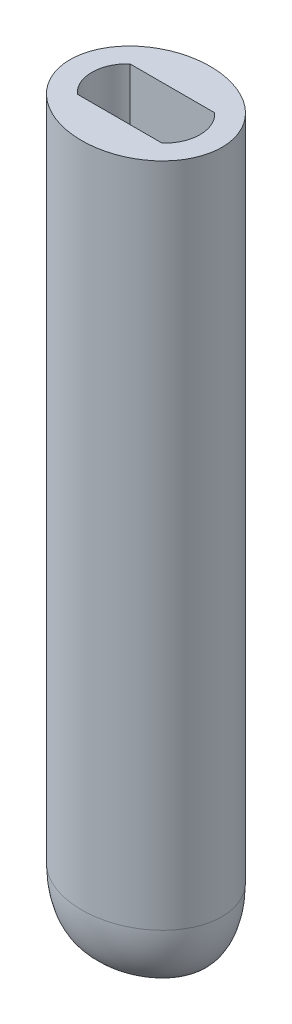
ISO-10303-21;
HEADER;
FILE_DESCRIPTION(('STEP AP214'),'2;1');
FILE_NAME('part.step','',(''),(''),'','','');
FILE_SCHEMA(('AUTOMOTIVE_DESIGN { 1 0 10303 214 1 1 1 1 }'));
ENDSEC;
DATA;
#1=APPLICATION_CONTEXT('core data for automotive mechanical design processes');
#2=APPLICATION_PROTOCOL_DEFINITION('international standard','automotive_design',2000,#1);
#3=PRODUCT_CONTEXT('',#1,'mechanical');
#4=PRODUCT('Part','Part','',(#3));
#5=PRODUCT_RELATED_PRODUCT_CATEGORY('part','',(#4));
#6=PRODUCT_DEFINITION_FORMATION('','',#4);
#7=PRODUCT_DEFINITION_CONTEXT('part definition',#1,'design');
#8=PRODUCT_DEFINITION('design','',#6,#7);
#9=PRODUCT_DEFINITION_SHAPE('','',#8);
#10=(LENGTH_UNIT() NAMED_UNIT(*) SI_UNIT(.MILLI.,.METRE.));
#11=(NAMED_UNIT(*) PLANE_ANGLE_UNIT() SI_UNIT($,.RADIAN.));
#12=(NAMED_UNIT(*) SI_UNIT($,.STERADIAN.) SOLID_ANGLE_UNIT());
#13=UNCERTAINTY_MEASURE_WITH_UNIT(LENGTH_MEASURE(1.E-05),#10,'distance_accuracy_value','');
#14=(GEOMETRIC_REPRESENTATION_CONTEXT(3) GLOBAL_UNCERTAINTY_ASSIGNED_CONTEXT((#13)) GLOBAL_UNIT_ASSIGNED_CONTEXT((#10,
#11,#12)) REPRESENTATION_CONTEXT('',''));
#15=CARTESIAN_POINT('',(0.,0.,0.));
#16=DIRECTION('',(0.,0.,1.));
#17=DIRECTION('',(1.,0.,0.));
#18=AXIS2_PLACEMENT_3D('',#15,#16,#17);
#19=CARTESIAN_POINT('',(0.,124.,0.));
#20=DIRECTION('',(0.,1.,0.));
#21=DIRECTION('',(1.,0.,0.));
#22=AXIS2_PLACEMENT_3D('',#19,#20,#21);
#23=ELLIPSE('',#22,13.,11.);
#24=DIRECTION('',(0.,-1.,0.));
#25=VECTOR('',#24,1.);
#26=SURFACE_OF_LINEAR_EXTRUSION('',#23,#25);
#27=CARTESIAN_POINT('',(0.,9.99999999999999,0.));
#28=DIRECTION('',(0.,1.,0.));
#29=DIRECTION('',(1.,0.,0.));
#30=AXIS2_PLACEMENT_3D('',#27,#28,#29);
#31=ELLIPSE('',#30,13.,11.);
#32=CARTESIAN_POINT('',(13.,9.99999999999999,0.));
#33=VERTEX_POINT('',#32);
#34=EDGE_CURVE('E63',#33,#33,#31,.T.);
#35=ORIENTED_EDGE('',*,*,#34,.T.);
#36=EDGE_LOOP('',(#35));
#37=FACE_BOUND('',#36,.T.);
#38=CARTESIAN_POINT('',(13.,124.,0.));
#39=VERTEX_POINT('',#38);
#40=EDGE_CURVE('E170',#39,#39,#23,.T.);
#41=ORIENTED_EDGE('',*,*,#40,.F.);
#42=EDGE_LOOP('',(#41));
#43=FACE_BOUND('',#42,.T.);
#44=ADVANCED_FACE('F48',(#37,#43),#26,.F.);
#45=CARTESIAN_POINT('',(0.,124.,0.));
#46=DIRECTION('',(0.,1.,0.));
#47=DIRECTION('',(0.,0.,1.));
#48=AXIS2_PLACEMENT_3D('',#45,#46,#47);
#49=PLANE('',#48);
#50=DIRECTION('',(-1.,0.,0.));
#51=VECTOR('',#50,1.);
#52=CARTESIAN_POINT('',(0.,124.,-4.5));
#53=LINE('',#52,#51);
#54=CARTESIAN_POINT('',(7.25,124.,-4.5));
#55=VERTEX_POINT('',#54);
#56=CARTESIAN_POINT('',(-7.25,124.,-4.5));
#57=VERTEX_POINT('',#56);
#58=EDGE_CURVE('E141',#55,#57,#53,.T.);
#59=ORIENTED_EDGE('',*,*,#58,.F.);
#60=CARTESIAN_POINT('',(3.18750000000001,124.,0.));
#61=DIRECTION('',(0.,1.,0.));
#62=DIRECTION('',(0.,0.,1.));
#63=AXIS2_PLACEMENT_3D('',#60,#61,#62);
#64=CIRCLE('',#63,6.06249999999999);
#65=CARTESIAN_POINT('',(7.25,124.,4.5));
#66=VERTEX_POINT('',#65);
#67=EDGE_CURVE('E127',#66,#55,#64,.T.);
#68=ORIENTED_EDGE('',*,*,#67,.F.);
#69=DIRECTION('',(-1.,0.,0.));
#70=VECTOR('',#69,1.);
#71=CARTESIAN_POINT('',(0.,124.,4.5));
#72=LINE('',#71,#70);
#73=CARTESIAN_POINT('',(-7.25,124.,4.5));
#74=VERTEX_POINT('',#73);
#75=EDGE_CURVE('E117',#66,#74,#72,.T.);
#76=ORIENTED_EDGE('',*,*,#75,.T.);
#77=CARTESIAN_POINT('',(-3.18750000000001,124.,0.));
#78=DIRECTION('',(0.,1.,0.));
#79=DIRECTION('',(0.,0.,1.));
#80=AXIS2_PLACEMENT_3D('',#77,#78,#79);
#81=CIRCLE('',#80,6.0625);
#82=EDGE_CURVE('E159',#57,#74,#81,.T.);
#83=ORIENTED_EDGE('',*,*,#82,.F.);
#84=EDGE_LOOP('',(#59,#68,#76,#83));
#85=FACE_BOUND('',#84,.T.);
#86=ORIENTED_EDGE('',*,*,#40,.T.);
#87=EDGE_LOOP('',(#86));
#88=FACE_BOUND('',#87,.T.);
#89=ADVANCED_FACE('F197',(#85,#88),#49,.T.);
#90=CARTESIAN_POINT('',(0.,0.,0.));
#91=DIRECTION('',(0.,1.,0.));
#92=DIRECTION('',(0.,0.,1.));
#93=AXIS2_PLACEMENT_3D('',#90,#91,#92);
#94=PLANE('',#93);
#95=CARTESIAN_POINT('',(8.,0.,0.));
#96=CARTESIAN_POINT('',(7.99999999972763,0.,-0.228877442948684));
#97=CARTESIAN_POINT('',(7.98164236606913,0.,-0.459540016333988));
#98=CARTESIAN_POINT('',(7.90790402202729,0.,-0.9183049047839));
#99=CARTESIAN_POINT('',(7.85340341439475,0.,-1.14212034129708));
#100=CARTESIAN_POINT('',(7.64180863958996,0.,-1.79838162336414));
#101=CARTESIAN_POINT('',(7.43333908743893,0.,-2.21959352487654));
#102=CARTESIAN_POINT('',(6.92903329010157,0.,-2.98595239298466));
#103=CARTESIAN_POINT('',(6.63069425532383,0.,-3.33824763709381));
#104=CARTESIAN_POINT('',(5.96426530908331,0.,-3.98002289664604));
#105=CARTESIAN_POINT('',(5.60409911853582,0.,-4.26253454395652));
#106=CARTESIAN_POINT('',(4.83922363735247,0.,-4.76413385704761));
#107=CARTESIAN_POINT('',(4.43096100447353,0.,-4.98442598860135));
#108=CARTESIAN_POINT('',(3.58985783020149,0.,-5.35775624144088));
#109=CARTESIAN_POINT('',(3.15937499623236,0.,-5.51047539568657));
#110=CARTESIAN_POINT('',(1.84116575911605,0.,-5.87716205036435));
#111=CARTESIAN_POINT('',(0.915424036952234,0.,-5.99982690128381));
#112=CARTESIAN_POINT('',(-0.454769357822972,0.,-6.00008627084414));
#113=CARTESIAN_POINT('',(-0.910480837044084,0.,-5.97019375078479));
#114=CARTESIAN_POINT('',(-1.819805851432,0.,-5.84872669287733));
#115=CARTESIAN_POINT('',(-2.27517016456728,0.,-5.7562028964282));
#116=CARTESIAN_POINT('',(-3.59588571633571,0.,-5.38951152925792));
#117=CARTESIAN_POINT('',(-4.43236282833363,0.,-5.02864672327698));
#118=CARTESIAN_POINT('',(-5.59566302731619,0.,-4.26918806976489));
#119=CARTESIAN_POINT('',(-5.95679519244455,0.,-3.98593431323932));
#120=CARTESIAN_POINT('',(-6.61861938618145,0.,-3.35112079939542));
#121=CARTESIAN_POINT('',(-6.92232818280514,0.,-2.99464865820981));
#122=CARTESIAN_POINT('',(-7.30237128962722,0.,-2.41933873385911));
#123=CARTESIAN_POINT('',(-7.41696257263887,0.,-2.22057571547325));
#124=CARTESIAN_POINT('',(-7.61944686589255,0.,-1.80760666743317));
#125=CARTESIAN_POINT('',(-7.70789802865545,0.,-1.5915571215976));
#126=CARTESIAN_POINT('',(-7.9224305128259,0.,-0.931597655198713));
#127=CARTESIAN_POINT('',(-7.99851139857637,0.,-0.479397298639151));
#128=CARTESIAN_POINT('',(-8.0014458658257,0.,0.452261224488354));
#129=CARTESIAN_POINT('',(-7.92804620718767,0.,0.905714056413743));
#130=CARTESIAN_POINT('',(-7.71715573948729,0.,1.56702613222351));
#131=CARTESIAN_POINT('',(-7.62986658955126,0.,1.7835818314944));
#132=CARTESIAN_POINT('',(-7.42907233675657,0.,2.19835832257909));
#133=CARTESIAN_POINT('',(-7.31505449422945,0.,2.39830644193684));
#134=CARTESIAN_POINT('',(-7.06216100495188,0.,2.78462445184592));
#135=CARTESIAN_POINT('',(-6.92249968933252,0.,2.97173328183747));
#136=CARTESIAN_POINT('',(-6.62653568459602,0.,3.32531076864082));
#137=CARTESIAN_POINT('',(-6.46971741730565,0.,3.49277132963876));
#138=CARTESIAN_POINT('',(-5.97554905754585,0.,3.97011931396288));
#139=CARTESIAN_POINT('',(-5.61250945538473,0.,4.25663662708803));
#140=CARTESIAN_POINT('',(-4.83998445239494,0.,4.7640128923043));
#141=CARTESIAN_POINT('',(-4.43694874158167,0.,4.98120763977985));
#142=CARTESIAN_POINT('',(-3.60205593094995,0.,5.35289058711788));
#143=CARTESIAN_POINT('',(-3.17014136860081,0.,5.50725376604027));
#144=CARTESIAN_POINT('',(-1.83284069570989,0.,5.87992798274595));
#145=CARTESIAN_POINT('',(-0.925176610477265,0.,5.99976799148196));
#146=CARTESIAN_POINT('',(0.458684438653842,0.,6.00011551407796));
#147=CARTESIAN_POINT('',(0.919318873192822,0.,5.96932013924091));
#148=CARTESIAN_POINT('',(1.82454636805553,0.,5.84778185094474));
#149=CARTESIAN_POINT('',(2.27143787700007,0.,5.75708114280177));
#150=CARTESIAN_POINT('',(3.1531594860563,0.,5.51258958596749));
#151=CARTESIAN_POINT('',(3.59154999683439,0.,5.35709167160275));
#152=CARTESIAN_POINT('',(4.43209390908302,0.,4.98383633713673));
#153=CARTESIAN_POINT('',(4.83489158182094,0.,4.76669223705946));
#154=CARTESIAN_POINT('',(5.6015833961141,0.,4.26446436976961));
#155=CARTESIAN_POINT('',(5.96888381584621,0.,3.97590262652142));
#156=CARTESIAN_POINT('',(6.63113170719435,0.,3.33749647917524));
#157=CARTESIAN_POINT('',(6.92809814457379,0.,2.9878034555853));
#158=CARTESIAN_POINT('',(7.43744824333454,0.,2.21291645027878));
#159=CARTESIAN_POINT('',(7.64216682969166,0.,1.79792700009657));
#160=CARTESIAN_POINT('',(7.85416919760889,0.,1.13941491551006));
#161=CARTESIAN_POINT('',(7.90924609344523,0.,0.91150345538579));
#162=CARTESIAN_POINT('',(7.98180434825774,0.,0.456951641803168));
#163=CARTESIAN_POINT('',(8.00000000027237,0.,0.228877442948682));
#164=CARTESIAN_POINT('',(8.,0.,0.));
#165=(BOUNDED_CURVE() B_SPLINE_CURVE(3,(#95,#96,#97,#98,#99,#100,#101,#102,#103,#104,#105,#106,
#107,#108,#109,#110,#111,#112,#113,#114,#115,#116,#117,#118,#119,#120,#121,#122,#123,#124,#125,
#126,#127,#128,#129,#130,#131,#132,#133,#134,#135,#136,#137,#138,#139,#140,#141,#142,#143,#144,
#145,#146,#147,#148,#149,#150,#151,#152,#153,#154,#155,#156,#157,#158,#159,#160,#161,#162,#163,
#164),.UNSPECIFIED.,.T.,.F.) B_SPLINE_CURVE_WITH_KNOTS((4,2,2,2,2,2,2,2,2,2,2,2,2,2,2,2,2,2,2,2,
2,2,2,2,2,2,2,2,2,2,2,2,2,2,4),(0.0010101898899887,0.00169615415200086,0.00238211841401302,
0.00375404693803733,0.00512597546206164,0.00649790398608596,0.00786983251011027,
0.00924176103413459,0.0119856180821832,0.0133575466062075,0.0147294751302318,0.0174733321782805,
0.0188452607023048,0.0202171892263291,0.0209031534883413,0.0215891177503534,0.0229610462743777,
0.024332974798402,0.0250189390604142,0.0257049033224264,0.0263908675844385,0.0270768318464507,
0.028448760370475,0.0298206888944993,0.0311926174185236,0.0339364744665722,0.0353084029905966,
0.0366803315146209,0.0380522600386452,0.0394241885626695,0.0407961170866938,0.0421680456107181,
0.0435399741347424,0.0442259383967546,0.0449119026587667),
.UNSPECIFIED.) CURVE() GEOMETRIC_REPRESENTATION_ITEM() RATIONAL_B_SPLINE_CURVE((1.,1.,1.,1.,1.,
1.,1.,1.,1.,1.,1.,1.,1.,1.,1.,1.,1.,1.,1.,1.,1.,1.,1.,1.,1.,1.,1.,1.,1.,1.,1.,1.,1.,1.,1.,1.,1.,
1.,1.,1.,1.,1.,1.,1.,1.,1.,1.,1.,1.,1.,1.,1.,1.,1.,1.,1.,1.,1.,1.,1.,1.,1.,1.,1.,1.,1.,1.,1.,1.,1.)) REPRESENTATION_ITEM(''));
#166=CARTESIAN_POINT('',(8.,0.,0.));
#167=VERTEX_POINT('',#166);
#168=EDGE_CURVE('E12',#167,#167,#165,.F.);
#169=ORIENTED_EDGE('',*,*,#168,.T.);
#170=EDGE_LOOP('',(#169));
#171=FACE_BOUND('',#170,.T.);
#172=ADVANCED_FACE('F199',(#171),#94,.F.);
#173=CARTESIAN_POINT('',(3.18750000000001,94.,0.));
#174=DIRECTION('',(0.,1.,0.));
#175=DIRECTION('',(0.,0.,1.));
#176=AXIS2_PLACEMENT_3D('',#173,#174,#175);
#177=CYLINDRICAL_SURFACE('',#176,6.06249999999999);
#178=ORIENTED_EDGE('',*,*,#67,.T.);
#179=DIRECTION('',(0.,1.,0.));
#180=VECTOR('',#179,1.);
#181=CARTESIAN_POINT('',(7.25,94.,-4.5));
#182=LINE('',#181,#180);
#183=CARTESIAN_POINT('',(7.25,94.,-4.5));
#184=VERTEX_POINT('',#183);
#185=EDGE_CURVE('E179',#184,#55,#182,.T.);
#186=ORIENTED_EDGE('',*,*,#185,.F.);
#187=CARTESIAN_POINT('',(3.18750000000001,94.,0.));
#188=DIRECTION('',(0.,1.,0.));
#189=DIRECTION('',(0.,0.,1.));
#190=AXIS2_PLACEMENT_3D('',#187,#188,#189);
#191=CIRCLE('',#190,6.06249999999999);
#192=CARTESIAN_POINT('',(7.25,94.,4.5));
#193=VERTEX_POINT('',#192);
#194=EDGE_CURVE('E173',#193,#184,#191,.T.);
#195=ORIENTED_EDGE('',*,*,#194,.F.);
#196=DIRECTION('',(0.,1.,0.));
#197=VECTOR('',#196,1.);
#198=CARTESIAN_POINT('',(7.25,94.,4.5));
#199=LINE('',#198,#197);
#200=EDGE_CURVE('E167',#193,#66,#199,.T.);
#201=ORIENTED_EDGE('',*,*,#200,.T.);
#202=EDGE_LOOP('',(#178,#186,#195,#201));
#203=FACE_BOUND('',#202,.T.);
#204=ADVANCED_FACE('F262',(#203),#177,.F.);
#205=CARTESIAN_POINT('',(3.18750000000001,94.,0.));
#206=DIRECTION('',(0.,1.,0.));
#207=DIRECTION('',(0.,0.,1.));
#208=AXIS2_PLACEMENT_3D('',#205,#206,#207);
#209=PLANE('',#208);
#210=ORIENTED_EDGE('',*,*,#194,.T.);
#211=DIRECTION('',(0.,0.,-1.));
#212=VECTOR('',#211,1.);
#213=CARTESIAN_POINT('',(7.25,94.,0.));
#214=LINE('',#213,#212);
#215=EDGE_CURVE('E78',#193,#184,#214,.T.);
#216=ORIENTED_EDGE('',*,*,#215,.F.);
#217=EDGE_LOOP('',(#210,#216));
#218=FACE_BOUND('',#217,.T.);
#219=ADVANCED_FACE('F258',(#218),#209,.T.);
#220=CARTESIAN_POINT('',(-3.18750000000001,94.,0.));
#221=DIRECTION('',(0.,1.,0.));
#222=DIRECTION('',(0.,0.,1.));
#223=AXIS2_PLACEMENT_3D('',#220,#221,#222);
#224=CYLINDRICAL_SURFACE('',#223,6.0625);
#225=ORIENTED_EDGE('',*,*,#82,.T.);
#226=DIRECTION('',(0.,1.,0.));
#227=VECTOR('',#226,1.);
#228=CARTESIAN_POINT('',(-7.25,94.,4.5));
#229=LINE('',#228,#227);
#230=CARTESIAN_POINT('',(-7.25,94.,4.5));
#231=VERTEX_POINT('',#230);
#232=EDGE_CURVE('E163',#231,#74,#229,.T.);
#233=ORIENTED_EDGE('',*,*,#232,.F.);
#234=CARTESIAN_POINT('',(-3.18750000000001,94.,0.));
#235=DIRECTION('',(0.,1.,0.));
#236=DIRECTION('',(0.,0.,1.));
#237=AXIS2_PLACEMENT_3D('',#234,#235,#236);
#238=CIRCLE('',#237,6.0625);
#239=CARTESIAN_POINT('',(-7.25,94.,-4.5));
#240=VERTEX_POINT('',#239);
#241=EDGE_CURVE('E154',#240,#231,#238,.T.);
#242=ORIENTED_EDGE('',*,*,#241,.F.);
#243=DIRECTION('',(0.,1.,0.));
#244=VECTOR('',#243,1.);
#245=CARTESIAN_POINT('',(-7.25,94.,-4.5));
#246=LINE('',#245,#244);
#247=EDGE_CURVE('E124',#240,#57,#246,.T.);
#248=ORIENTED_EDGE('',*,*,#247,.T.);
#249=EDGE_LOOP('',(#225,#233,#242,#248));
#250=FACE_BOUND('',#249,.T.);
#251=ADVANCED_FACE('F254',(#250),#224,.F.);
#252=CARTESIAN_POINT('',(-3.18750000000001,94.,0.));
#253=DIRECTION('',(0.,1.,0.));
#254=DIRECTION('',(0.,0.,1.));
#255=AXIS2_PLACEMENT_3D('',#252,#253,#254);
#256=PLANE('',#255);
#257=ORIENTED_EDGE('',*,*,#241,.T.);
#258=DIRECTION('',(0.,0.,-1.));
#259=VECTOR('',#258,1.);
#260=CARTESIAN_POINT('',(-7.25,94.,0.));
#261=LINE('',#260,#259);
#262=EDGE_CURVE('E158',#231,#240,#261,.T.);
#263=ORIENTED_EDGE('',*,*,#262,.T.);
#264=EDGE_LOOP('',(#257,#263));
#265=FACE_BOUND('',#264,.T.);
#266=ADVANCED_FACE('F251',(#265),#256,.T.);
#267=CARTESIAN_POINT('',(-7.25,24.,0.));
#268=DIRECTION('',(1.,0.,0.));
#269=DIRECTION('',(0.,0.,-1.));
#270=AXIS2_PLACEMENT_3D('',#267,#268,#269);
#271=PLANE('',#270);
#272=DIRECTION('',(0.,1.,0.));
#273=VECTOR('',#272,1.);
#274=CARTESIAN_POINT('',(-7.25,24.,4.5));
#275=LINE('',#274,#273);
#276=CARTESIAN_POINT('',(-7.25,24.,4.5));
#277=VERTEX_POINT('',#276);
#278=EDGE_CURVE('E111',#277,#231,#275,.T.);
#279=ORIENTED_EDGE('',*,*,#278,.F.);
#280=DIRECTION('',(0.,0.,-1.));
#281=VECTOR('',#280,1.);
#282=CARTESIAN_POINT('',(-7.25,24.,0.));
#283=LINE('',#282,#281);
#284=CARTESIAN_POINT('',(-7.25,24.,-4.5));
#285=VERTEX_POINT('',#284);
#286=EDGE_CURVE('E108',#277,#285,#283,.T.);
#287=ORIENTED_EDGE('',*,*,#286,.T.);
#288=DIRECTION('',(0.,1.,0.));
#289=VECTOR('',#288,1.);
#290=CARTESIAN_POINT('',(-7.25,24.,-4.5));
#291=LINE('',#290,#289);
#292=EDGE_CURVE('E70',#285,#240,#291,.T.);
#293=ORIENTED_EDGE('',*,*,#292,.T.);
#294=ORIENTED_EDGE('',*,*,#262,.F.);
#295=EDGE_LOOP('',(#279,#287,#293,#294));
#296=FACE_BOUND('',#295,.T.);
#297=ADVANCED_FACE('F109',(#296),#271,.T.);
#298=CARTESIAN_POINT('',(0.,24.,-4.5));
#299=DIRECTION('',(0.,0.,-1.));
#300=DIRECTION('',(-1.,0.,0.));
#301=AXIS2_PLACEMENT_3D('',#298,#299,#300);
#302=PLANE('',#301);
#303=ORIENTED_EDGE('',*,*,#58,.T.);
#304=ORIENTED_EDGE('',*,*,#247,.F.);
#305=ORIENTED_EDGE('',*,*,#292,.F.);
#306=DIRECTION('',(-1.,0.,0.));
#307=VECTOR('',#306,1.);
#308=CARTESIAN_POINT('',(0.,24.,-4.5));
#309=LINE('',#308,#307);
#310=CARTESIAN_POINT('',(7.25,24.,-4.5));
#311=VERTEX_POINT('',#310);
#312=EDGE_CURVE('E116',#311,#285,#309,.T.);
#313=ORIENTED_EDGE('',*,*,#312,.F.);
#314=DIRECTION('',(0.,1.,0.));
#315=VECTOR('',#314,1.);
#316=CARTESIAN_POINT('',(7.25,24.,-4.5));
#317=LINE('',#316,#315);
#318=EDGE_CURVE('E128',#311,#184,#317,.T.);
#319=ORIENTED_EDGE('',*,*,#318,.T.);
#320=ORIENTED_EDGE('',*,*,#185,.T.);
#321=EDGE_LOOP('',(#303,#304,#305,#313,#319,#320));
#322=FACE_BOUND('',#321,.T.);
#323=ADVANCED_FACE('F121',(#322),#302,.F.);
#324=CARTESIAN_POINT('',(7.25,24.,0.));
#325=DIRECTION('',(1.,0.,0.));
#326=DIRECTION('',(0.,0.,-1.));
#327=AXIS2_PLACEMENT_3D('',#324,#325,#326);
#328=PLANE('',#327);
#329=ORIENTED_EDGE('',*,*,#215,.T.);
#330=ORIENTED_EDGE('',*,*,#318,.F.);
#331=DIRECTION('',(0.,0.,-1.));
#332=VECTOR('',#331,1.);
#333=CARTESIAN_POINT('',(7.25,24.,0.));
#334=LINE('',#333,#332);
#335=CARTESIAN_POINT('',(7.25,24.,4.5));
#336=VERTEX_POINT('',#335);
#337=EDGE_CURVE('E132',#336,#311,#334,.T.);
#338=ORIENTED_EDGE('',*,*,#337,.F.);
#339=DIRECTION('',(0.,1.,0.));
#340=VECTOR('',#339,1.);
#341=CARTESIAN_POINT('',(7.25,24.,4.5));
#342=LINE('',#341,#340);
#343=EDGE_CURVE('E149',#336,#193,#342,.T.);
#344=ORIENTED_EDGE('',*,*,#343,.T.);
#345=EDGE_LOOP('',(#329,#330,#338,#344));
#346=FACE_BOUND('',#345,.T.);
#347=ADVANCED_FACE('F241',(#346),#328,.F.);
#348=CARTESIAN_POINT('',(0.,24.,4.5));
#349=DIRECTION('',(0.,0.,-1.));
#350=DIRECTION('',(-1.,0.,0.));
#351=AXIS2_PLACEMENT_3D('',#348,#349,#350);
#352=PLANE('',#351);
#353=ORIENTED_EDGE('',*,*,#75,.F.);
#354=ORIENTED_EDGE('',*,*,#200,.F.);
#355=ORIENTED_EDGE('',*,*,#343,.F.);
#356=DIRECTION('',(-1.,0.,0.));
#357=VECTOR('',#356,1.);
#358=CARTESIAN_POINT('',(0.,24.,4.5));
#359=LINE('',#358,#357);
#360=EDGE_CURVE('E136',#336,#277,#359,.T.);
#361=ORIENTED_EDGE('',*,*,#360,.T.);
#362=ORIENTED_EDGE('',*,*,#278,.T.);
#363=ORIENTED_EDGE('',*,*,#232,.T.);
#364=EDGE_LOOP('',(#353,#354,#355,#361,#362,#363));
#365=FACE_BOUND('',#364,.T.);
#366=ADVANCED_FACE('F236',(#365),#352,.T.);
#367=CARTESIAN_POINT('',(0.,24.,0.));
#368=DIRECTION('',(0.,1.,0.));
#369=DIRECTION('',(0.,0.,1.));
#370=AXIS2_PLACEMENT_3D('',#367,#368,#369);
#371=PLANE('',#370);
#372=ORIENTED_EDGE('',*,*,#286,.F.);
#373=ORIENTED_EDGE('',*,*,#360,.F.);
#374=ORIENTED_EDGE('',*,*,#337,.T.);
#375=ORIENTED_EDGE('',*,*,#312,.T.);
#376=EDGE_LOOP('',(#372,#373,#374,#375));
#377=FACE_BOUND('',#376,.T.);
#378=ADVANCED_FACE('F130',(#377),#371,.T.);
#379=CARTESIAN_POINT('',(13.,9.99999999999999,0.));
#380=CARTESIAN_POINT('',(13.,9.99999999999999,-0.494538756263981));
#381=CARTESIAN_POINT('',(12.9600966714673,9.99999999999999,-0.992855571471706));
#382=CARTESIAN_POINT('',(12.8027255248294,9.99999999999999,-1.97194392215569));
#383=CARTESIAN_POINT('',(12.6872930588365,9.99999999999999,-2.44344703600244));
#384=CARTESIAN_POINT('',(12.2503093945552,9.99999999999999,-3.79875203463129));
#385=CARTESIAN_POINT('',(11.8333114744269,9.99999999999999,-4.62897007455198));
#386=CARTESIAN_POINT('',(10.8826193796786,9.99999999999999,-6.07367151089672));
#387=CARTESIAN_POINT('',(10.3431998412805,9.99999999999999,-6.70458902168347));
#388=CARTESIAN_POINT('',(9.1883384451937,9.99999999999999,-7.81672778655488));
#389=CARTESIAN_POINT('',(8.58584456802196,9.99999999999999,-8.28639209115669));
#390=CARTESIAN_POINT('',(7.34136599468267,9.99999999999999,-9.10251132940118));
#391=CARTESIAN_POINT('',(6.69375510648974,9.99999999999999,-9.45046419483079));
#392=CARTESIAN_POINT('',(5.38397078090047,9.99999999999999,-10.0318222559318));
#393=CARTESIAN_POINT('',(4.72515516781699,9.99999999999999,-10.2647646189493));
#394=CARTESIAN_POINT('',(2.72952917400694,9.99999999999999,-10.8198884923043));
#395=CARTESIAN_POINT('',(1.35707599975117,9.99999999999999,-10.999743388959));
#396=CARTESIAN_POINT('',(-0.674175634506404,9.99999999999999,-11.0001278926358));
#397=CARTESIAN_POINT('',(-1.34972747587856,9.99999999999999,-10.9559308429035));
#398=CARTESIAN_POINT('',(-2.70459242475534,9.99999999999999,-10.7749488446772));
#399=CARTESIAN_POINT('',(-3.38661484751376,9.99999999999999,-10.6367555498968));
#400=CARTESIAN_POINT('',(-5.38588585640378,9.99999999999999,-10.0816659865728));
#401=CARTESIAN_POINT('',(-6.68019041730696,9.99999999999999,-9.53235995315693));
#402=CARTESIAN_POINT('',(-8.57172889908903,9.99999999999999,-8.29747211696446));
#403=CARTESIAN_POINT('',(-9.17581572988162,9.99999999999999,-7.82656664467543));
#404=CARTESIAN_POINT('',(-10.3218651570286,9.99999999999999,-6.72729033285716));
#405=CARTESIAN_POINT('',(-10.870302314338,9.99999999999999,-6.0895762107376));
#406=CARTESIAN_POINT('',(-11.586261194285,9.99999999999999,-5.00575640522218));
#407=CARTESIAN_POINT('',(-11.8077340327366,9.99999999999999,-4.6229311608922));
#408=CARTESIAN_POINT('',(-12.2074659312453,9.99999999999999,-3.80767336216416));
#409=CARTESIAN_POINT('',(-12.3868954896017,9.99999999999999,-3.37131573288745));
#410=CARTESIAN_POINT('',(-12.8296564881425,9.99999999999999,-2.0092641419227));
#411=CARTESIAN_POINT('',(-12.9967835684145,9.99999999999999,-1.03583559700576));
#412=CARTESIAN_POINT('',(-13.003124092395,9.99999999999999,0.977202389811659));
#413=CARTESIAN_POINT('',(-12.8417008802703,9.99999999999999,1.95441956166363));
#414=CARTESIAN_POINT('',(-12.4057936244654,9.99999999999999,3.32134114126446));
#415=CARTESIAN_POINT('',(-12.2284000007469,9.99999999999999,3.75949308280113));
#416=CARTESIAN_POINT('',(-11.8313148975271,9.99999999999999,4.57974346955385));
#417=CARTESIAN_POINT('',(-11.610550065241,9.99999999999999,4.96553040672924));
#418=CARTESIAN_POINT('',(-11.1333749922135,9.99999999999999,5.69445911075847));
#419=CARTESIAN_POINT('',(-10.8755743326377,9.99999999999999,6.03890959904359));
#420=CARTESIAN_POINT('',(-10.3416179451955,9.99999999999999,6.67680796681931));
#421=CARTESIAN_POINT('',(-10.0644052066613,9.99999999999999,6.97220650929394));
#422=CARTESIAN_POINT('',(-9.20757563242147,9.99999999999999,7.79987153370382));
#423=CARTESIAN_POINT('',(-8.5996615313682,9.99999999999999,8.2767085911332));
#424=CARTESIAN_POINT('',(-7.34247237888126,9.99999999999999,9.10240087272759));
#425=CARTESIAN_POINT('',(-6.70324783751767,9.99999999999999,9.44537749964149));
#426=CARTESIAN_POINT('',(-5.40280106404952,9.99999999999999,10.0243187503234));
#427=CARTESIAN_POINT('',(-4.74150324185648,9.99999999999999,10.2598737782104));
#428=CARTESIAN_POINT('',(-2.71682874615215,9.99999999999999,10.8241028982665));
#429=CARTESIAN_POINT('',(-1.37153377311372,9.99999999999999,10.9996560567492));
#430=CARTESIAN_POINT('',(0.679979575532202,9.99999999999999,11.0001712449535));
#431=CARTESIAN_POINT('',(1.36286163175038,9.99999999999999,10.954633786658));
#432=CARTESIAN_POINT('',(2.71169039155212,9.99999999999999,10.773536394599));
#433=CARTESIAN_POINT('',(3.38099900725288,9.99999999999999,10.6380755872581));
#434=CARTESIAN_POINT('',(4.71566256211594,9.99999999999999,10.2679882881892));
#435=CARTESIAN_POINT('',(5.38657987862711,9.99999999999999,10.0307989117061));
#436=CARTESIAN_POINT('',(6.69554535916552,9.99999999999999,9.44953439928475));
#437=CARTESIAN_POINT('',(7.33441586391024,9.99999999999999,9.1066095267048));
#438=CARTESIAN_POINT('',(8.58165400389945,9.99999999999999,8.2895957854732));
#439=CARTESIAN_POINT('',(9.19623421237938,9.99999999999999,7.80969154458064));
#440=CARTESIAN_POINT('',(10.3440664205109,9.99999999999999,6.70318272212589));
#441=CARTESIAN_POINT('',(10.880763762762,9.99999999999999,6.07730210753143));
#442=CARTESIAN_POINT('',(11.8411511565719,9.99999999999999,4.61624083999349));
#443=CARTESIAN_POINT('',(12.251014423801,9.99999999999999,3.79792093302587));
#444=CARTESIAN_POINT('',(12.6888920146997,9.99999999999999,2.43780556251162));
#445=CARTESIAN_POINT('',(12.8055771874978,9.99999999999999,1.95750711292904));
#446=CARTESIAN_POINT('',(12.9604551980628,9.99999999999999,0.987251130385815));
#447=CARTESIAN_POINT('',(13.,9.99999999999999,0.494538756263977));
#448=CARTESIAN_POINT('',(13.,9.99999999999999,0.));
#449=CARTESIAN_POINT('',(13.,0.,0.));
#450=CARTESIAN_POINT('',(12.9999999994114,0.,-0.494538756263982));
#451=CARTESIAN_POINT('',(12.9600966671242,0.,-0.992855570773615));
#452=CARTESIAN_POINT('',(12.8027255291724,0.,-1.97194392285379));
#453=CARTESIAN_POINT('',(12.6872930552332,-1.20481699032869E-12,-2.44344703484055));
#454=CARTESIAN_POINT('',(12.2503094017618,2.38361312851772E-12,-3.79875203695508));
#455=CARTESIAN_POINT('',(11.8333114679806,-4.06534217326079E-13,-4.62897007030997));
#456=CARTESIAN_POINT('',(10.8826193861249,3.89186982566311E-13,-6.07367151513873));
#457=CARTESIAN_POINT('',(10.343199837171,0.,-6.70458901741614));
#458=CARTESIAN_POINT('',(9.18833844930317,0.,-7.81672779082221));
#459=CARTESIAN_POINT('',(8.58584456662172,-4.03617369209056E-13,-8.2863920890225));
#460=CARTESIAN_POINT('',(7.34136599608292,3.89739581401242E-13,-9.10251133153538));
#461=CARTESIAN_POINT('',(6.69375510558202,0.,-9.45046419278571));
#462=CARTESIAN_POINT('',(5.38397078180821,0.,-10.0318222579769));
#463=CARTESIAN_POINT('',(4.72515516758241,0.,-10.2647646181067));
#464=CARTESIAN_POINT('',(2.72952917447611,0.,-10.8198884939895));
#465=CARTESIAN_POINT('',(1.35707599975113,7.8536333646801E-13,-10.9997433887405));
#466=CARTESIAN_POINT('',(-0.674175634506384,-4.03090009089865E-13,-11.0001278927451));
#467=CARTESIAN_POINT('',(-1.34972747597706,0.,-10.9559308436408));
#468=CARTESIAN_POINT('',(-2.70459242465683,0.,-10.7749488439399));
#469=CARTESIAN_POINT('',(-3.38661484765811,0.,-10.636755550417));
#470=CARTESIAN_POINT('',(-5.38588585611509,0.,-10.0816659855324));
#471=CARTESIAN_POINT('',(-6.68019041937281,-8.12001231690003E-13,-9.5323599563213));
#472=CARTESIAN_POINT('',(-8.57172889805611,3.92990189775176E-13,-8.29747211538228));
#473=CARTESIAN_POINT('',(-9.1758157332489,3.89037858928419E-13,-7.82656664818579));
#474=CARTESIAN_POINT('',(-10.3218651536613,-4.06385093688187E-13,-6.7272903293468));
#475=CARTESIAN_POINT('',(-10.8703023195602,3.90025348133044E-13,-6.08957621418756));
#476=CARTESIAN_POINT('',(-11.5862611916739,-2.08023100136348E-13,-5.00575640349721));
#477=CARTESIAN_POINT('',(-11.8077340368731,0.,-4.62293116292041));
#478=CARTESIAN_POINT('',(-12.2074659271087,0.,-3.80767336013596));
#479=CARTESIAN_POINT('',(-12.3868954919176,0.,-3.37131573364023));
#480=CARTESIAN_POINT('',(-12.8296564835107,0.,-2.00926414041715));
#481=CARTESIAN_POINT('',(-12.9967835733891,0.,-1.03583559702143));
#482=CARTESIAN_POINT('',(-13.0031240874204,0.,0.97720238982733));
#483=CARTESIAN_POINT('',(-12.8417008756489,0.,1.95441956018976));
#484=CARTESIAN_POINT('',(-12.4057936267762,0.,3.3213411420014));
#485=CARTESIAN_POINT('',(-12.2283999967321,0.,3.75949308085748));
#486=CARTESIAN_POINT('',(-11.8313149015418,0.,4.5797434714975));
#487=CARTESIAN_POINT('',(-11.6105500627127,0.,4.96553040507436));
#488=CARTESIAN_POINT('',(-11.1333749947418,0.,5.69445911241336));
#489=CARTESIAN_POINT('',(-10.8755743299312,-4.08612723729165E-13,6.03890959677765));
#490=CARTESIAN_POINT('',(-10.341617947902,3.91265488969395E-13,6.67680796908526));
#491=CARTESIAN_POINT('',(-10.0644052050493,0.,6.97220650762518));
#492=CARTESIAN_POINT('',(-9.20757563564542,0.,7.79987153704137));
#493=CARTESIAN_POINT('',(-8.5996615293535,0.,8.27670858806503));
#494=CARTESIAN_POINT('',(-7.34247238089597,0.,9.10240087579577));
#495=CARTESIAN_POINT('',(-6.70324783687369,-4.05010057453061E-13,9.44537749819495));
#496=CARTESIAN_POINT('',(-5.4028010646935,3.87662822693294E-13,10.0243187517699));
#497=CARTESIAN_POINT('',(-4.74150324176391,0.,10.2598737778782));
#498=CARTESIAN_POINT('',(-2.7168287463373,0.,10.8241028989309));
#499=CARTESIAN_POINT('',(-1.37153377311392,7.9153182426912E-13,10.9996560575404));
#500=CARTESIAN_POINT('',(0.679979575532302,-4.08776338204388E-13,11.0001712445579));
#501=CARTESIAN_POINT('',(1.36286163178219,0.,10.9546337868942));
#502=CARTESIAN_POINT('',(2.71169039152031,0.,10.7735363943628));
#503=CARTESIAN_POINT('',(3.38099900757935,0.,10.6380755884347));
#504=CARTESIAN_POINT('',(4.71566256178948,0.,10.2679882870126));
#505=CARTESIAN_POINT('',(5.38657987910821,0.,10.0307989127895));
#506=CARTESIAN_POINT('',(6.69554535868442,0.,9.44953439820136));
#507=CARTESIAN_POINT('',(7.33441586560481,0.,9.1066095292917));
#508=CARTESIAN_POINT('',(8.58165400220489,0.,8.28959578288631));
#509=CARTESIAN_POINT('',(9.19623421510031,0.,7.80969154740298));
#510=CARTESIAN_POINT('',(10.34406641779,0.,6.70318271930356));
#511=CARTESIAN_POINT('',(10.8807637704347,-1.21513190173577E-12,6.07730211257493));
#512=CARTESIAN_POINT('',(11.8411511488992,1.19778466697601E-12,4.61624083494999));
#513=CARTESIAN_POINT('',(12.2510144330262,1.19140297920087E-12,3.79792093599595));
#514=CARTESIAN_POINT('',(12.6888920100871,-6.08711915670262E-13,2.43780556102658));
#515=CARTESIAN_POINT('',(12.8055771885145,0.,1.95750711309133));
#516=CARTESIAN_POINT('',(12.9604551970461,0.,0.987251130223522));
#517=CARTESIAN_POINT('',(13.0000000005886,0.,0.494538756263977));
#518=CARTESIAN_POINT('',(13.,0.,0.));
#519=CARTESIAN_POINT('',(8.,0.,0.));
#520=CARTESIAN_POINT('',(7.99999999972763,0.,-0.228877442948684));
#521=CARTESIAN_POINT('',(7.98164236606913,0.,-0.459540016333988));
#522=CARTESIAN_POINT('',(7.90790402202729,0.,-0.9183049047839));
#523=CARTESIAN_POINT('',(7.85340341439475,0.,-1.14212034129708));
#524=CARTESIAN_POINT('',(7.64180863958996,0.,-1.79838162336414));
#525=CARTESIAN_POINT('',(7.43333908743893,0.,-2.21959352487654));
#526=CARTESIAN_POINT('',(6.92903329010157,0.,-2.98595239298466));
#527=CARTESIAN_POINT('',(6.63069425532383,0.,-3.33824763709381));
#528=CARTESIAN_POINT('',(5.96426530908331,0.,-3.98002289664604));
#529=CARTESIAN_POINT('',(5.60409911853582,0.,-4.26253454395652));
#530=CARTESIAN_POINT('',(4.83922363735247,0.,-4.76413385704761));
#531=CARTESIAN_POINT('',(4.43096100447353,0.,-4.98442598860135));
#532=CARTESIAN_POINT('',(3.58985783020149,0.,-5.35775624144088));
#533=CARTESIAN_POINT('',(3.15937499623236,0.,-5.51047539568657));
#534=CARTESIAN_POINT('',(1.84116575911605,0.,-5.87716205036435));
#535=CARTESIAN_POINT('',(0.915424036952234,0.,-5.99982690128381));
#536=CARTESIAN_POINT('',(-0.454769357822972,0.,-6.00008627084414));
#537=CARTESIAN_POINT('',(-0.910480837044084,0.,-5.97019375078479));
#538=CARTESIAN_POINT('',(-1.819805851432,0.,-5.84872669287733));
#539=CARTESIAN_POINT('',(-2.27517016456728,0.,-5.7562028964282));
#540=CARTESIAN_POINT('',(-3.59588571633571,0.,-5.38951152925792));
#541=CARTESIAN_POINT('',(-4.43236282833363,0.,-5.02864672327698));
#542=CARTESIAN_POINT('',(-5.59566302731619,0.,-4.26918806976489));
#543=CARTESIAN_POINT('',(-5.95679519244455,0.,-3.98593431323932));
#544=CARTESIAN_POINT('',(-6.61861938618145,0.,-3.35112079939542));
#545=CARTESIAN_POINT('',(-6.92232818280514,0.,-2.99464865820981));
#546=CARTESIAN_POINT('',(-7.30237128962722,0.,-2.41933873385911));
#547=CARTESIAN_POINT('',(-7.41696257263887,0.,-2.22057571547325));
#548=CARTESIAN_POINT('',(-7.61944686589255,0.,-1.80760666743317));
#549=CARTESIAN_POINT('',(-7.70789802865545,0.,-1.5915571215976));
#550=CARTESIAN_POINT('',(-7.9224305128259,0.,-0.931597655198713));
#551=CARTESIAN_POINT('',(-7.99851139857637,0.,-0.479397298639151));
#552=CARTESIAN_POINT('',(-8.0014458658257,0.,0.452261224488354));
#553=CARTESIAN_POINT('',(-7.92804620718767,0.,0.905714056413743));
#554=CARTESIAN_POINT('',(-7.71715573948729,0.,1.56702613222351));
#555=CARTESIAN_POINT('',(-7.62986658955126,0.,1.7835818314944));
#556=CARTESIAN_POINT('',(-7.42907233675657,0.,2.19835832257909));
#557=CARTESIAN_POINT('',(-7.31505449422945,0.,2.39830644193684));
#558=CARTESIAN_POINT('',(-7.06216100495188,0.,2.78462445184592));
#559=CARTESIAN_POINT('',(-6.92249968933252,0.,2.97173328183747));
#560=CARTESIAN_POINT('',(-6.62653568459602,0.,3.32531076864082));
#561=CARTESIAN_POINT('',(-6.46971741730565,0.,3.49277132963876));
#562=CARTESIAN_POINT('',(-5.97554905754585,0.,3.97011931396288));
#563=CARTESIAN_POINT('',(-5.61250945538473,0.,4.25663662708803));
#564=CARTESIAN_POINT('',(-4.83998445239494,0.,4.7640128923043));
#565=CARTESIAN_POINT('',(-4.43694874158167,0.,4.98120763977985));
#566=CARTESIAN_POINT('',(-3.60205593094995,0.,5.35289058711788));
#567=CARTESIAN_POINT('',(-3.17014136860081,0.,5.50725376604027));
#568=CARTESIAN_POINT('',(-1.83284069570989,0.,5.87992798274595));
#569=CARTESIAN_POINT('',(-0.925176610477265,0.,5.99976799148196));
#570=CARTESIAN_POINT('',(0.458684438653842,0.,6.00011551407796));
#571=CARTESIAN_POINT('',(0.919318873192822,0.,5.96932013924091));
#572=CARTESIAN_POINT('',(1.82454636805553,0.,5.84778185094474));
#573=CARTESIAN_POINT('',(2.27143787700007,0.,5.75708114280177));
#574=CARTESIAN_POINT('',(3.1531594860563,0.,5.51258958596749));
#575=CARTESIAN_POINT('',(3.59154999683439,0.,5.35709167160275));
#576=CARTESIAN_POINT('',(4.43209390908302,0.,4.98383633713673));
#577=CARTESIAN_POINT('',(4.83489158182094,0.,4.76669223705946));
#578=CARTESIAN_POINT('',(5.6015833961141,0.,4.26446436976961));
#579=CARTESIAN_POINT('',(5.96888381584621,0.,3.97590262652142));
#580=CARTESIAN_POINT('',(6.63113170719435,0.,3.33749647917524));
#581=CARTESIAN_POINT('',(6.92809814457379,0.,2.9878034555853));
#582=CARTESIAN_POINT('',(7.43744824333454,0.,2.21291645027878));
#583=CARTESIAN_POINT('',(7.64216682969166,0.,1.79792700009657));
#584=CARTESIAN_POINT('',(7.85416919760889,0.,1.13941491551006));
#585=CARTESIAN_POINT('',(7.90924609344523,0.,0.91150345538579));
#586=CARTESIAN_POINT('',(7.98180434825774,0.,0.456951641803168));
#587=CARTESIAN_POINT('',(8.00000000027237,0.,0.228877442948682));
#588=CARTESIAN_POINT('',(8.,0.,0.));
#589=(BOUNDED_SURFACE() B_SPLINE_SURFACE(2,3,((#379,#380,#381,#382,#383,#384,#385,#386,#387,
#388,#389,#390,#391,#392,#393,#394,#395,#396,#397,#398,#399,#400,#401,#402,#403,#404,#405,#406,
#407,#408,#409,#410,#411,#412,#413,#414,#415,#416,#417,#418,#419,#420,#421,#422,#423,#424,#425,
#426,#427,#428,#429,#430,#431,#432,#433,#434,#435,#436,#437,#438,#439,#440,#441,#442,#443,#444,
#445,#446,#447,#448),(#449,#450,#451,#452,#453,#454,#455,#456,#457,#458,#459,#460,#461,#462,
#463,#464,#465,#466,#467,#468,#469,#470,#471,#472,#473,#474,#475,#476,#477,#478,#479,#480,#481,
#482,#483,#484,#485,#486,#487,#488,#489,#490,#491,#492,#493,#494,#495,#496,#497,#498,#499,#500,
#501,#502,#503,#504,#505,#506,#507,#508,#509,#510,#511,#512,#513,#514,#515,#516,#517,#518),
(#519,#520,#521,#522,#523,#524,#525,#526,#527,#528,#529,#530,#531,#532,#533,#534,#535,#536,#537,
#538,#539,#540,#541,#542,#543,#544,#545,#546,#547,#548,#549,#550,#551,#552,#553,#554,#555,#556,
#557,#558,#559,#560,#561,#562,#563,#564,#565,#566,#567,#568,#569,#570,#571,#572,#573,#574,#575,
#576,#577,#578,#579,#580,#581,#582,#583,#584,#585,#586,#587,#588)),.UNSPECIFIED.,.F.,.T.,
.F.) B_SPLINE_SURFACE_WITH_KNOTS((3,3),(4,2,2,2,2,2,2,2,2,2,2,2,2,2,2,2,2,2,2,2,2,2,2,2,2,2,2,2,
2,2,2,2,2,2,4),(0.,1.),(0.0010101898899887,0.00169615415200086,0.00238211841401302,
0.00375404693803733,0.00512597546206164,0.00649790398608596,0.00786983251011027,
0.00924176103413459,0.0119856180821832,0.0133575466062075,0.0147294751302318,0.0174733321782805,
0.0188452607023048,0.0202171892263291,0.0209031534883413,0.0215891177503534,0.0229610462743777,
0.024332974798402,0.0250189390604142,0.0257049033224264,0.0263908675844385,0.0270768318464507,
0.028448760370475,0.0298206888944993,0.0311926174185236,0.0339364744665722,0.0353084029905966,
0.0366803315146209,0.0380522600386452,0.0394241885626695,0.0407961170866938,0.0421680456107181,
0.0435399741347424,0.0442259383967546,0.0449119026587667),
.UNSPECIFIED.) GEOMETRIC_REPRESENTATION_ITEM() RATIONAL_B_SPLINE_SURFACE(((1.,1.,1.,1.,1.,1.,1.,
1.,1.,1.,1.,1.,1.,1.,1.,1.,1.,1.,1.,1.,1.,1.,1.,1.,1.,1.,1.,1.,1.,1.,1.,1.,1.,1.,1.,1.,1.,1.,1.,
1.,1.,1.,1.,1.,1.,1.,1.,1.,1.,1.,1.,1.,1.,1.,1.,1.,1.,1.,1.,1.,1.,1.,1.,1.,1.,1.,1.,1.,1.,1.),
(0.707106781186547,0.707106781186547,0.707106781186547,0.707106781186547,0.707106781186547,
0.707106781186547,0.707106781186547,0.707106781186547,0.707106781186547,0.707106781186547,
0.707106781186547,0.707106781186547,0.707106781186547,0.707106781186547,0.707106781186547,
0.707106781186547,0.707106781186547,0.707106781186547,0.707106781186547,0.707106781186547,
0.707106781186547,0.707106781186547,0.707106781186547,0.707106781186547,0.707106781186547,
0.707106781186547,0.707106781186547,0.707106781186547,0.707106781186547,0.707106781186547,
0.707106781186547,0.707106781186547,0.707106781186547,0.707106781186547,0.707106781186547,
0.707106781186547,0.707106781186547,0.707106781186547,0.707106781186547,0.707106781186547,
0.707106781186547,0.707106781186547,0.707106781186547,0.707106781186547,0.707106781186547,
0.707106781186547,0.707106781186547,0.707106781186547,0.707106781186547,0.707106781186547,
0.707106781186547,0.707106781186547,0.707106781186547,0.707106781186547,0.707106781186547,
0.707106781186547,0.707106781186547,0.707106781186547,0.707106781186547,0.707106781186547,
0.707106781186547,0.707106781186547,0.707106781186547,0.707106781186547,0.707106781186547,
0.707106781186547,0.707106781186547,0.707106781186547,0.707106781186547,0.707106781186547),(1.,
1.,1.,1.,1.,1.,1.,1.,1.,1.,1.,1.,1.,1.,1.,1.,1.,1.,1.,1.,1.,1.,1.,1.,1.,1.,1.,1.,1.,1.,1.,1.,1.,
1.,1.,1.,1.,1.,1.,1.,1.,1.,1.,1.,1.,1.,1.,1.,1.,1.,1.,1.,1.,1.,1.,1.,1.,1.,1.,1.,1.,1.,1.,1.,1.,
1.,1.,1.,1.,1.))) REPRESENTATION_ITEM('') SURFACE());
#590=ORIENTED_EDGE('',*,*,#168,.F.);
#591=EDGE_LOOP('',(#590));
#592=FACE_BOUND('',#591,.T.);
#593=ORIENTED_EDGE('',*,*,#34,.F.);
#594=EDGE_LOOP('',(#593));
#595=FACE_BOUND('',#594,.T.);
#596=ADVANCED_FACE('F51',(#592,#595),#589,.T.);
#597=CLOSED_SHELL('',(#44,#89,#172,#204,#219,#251,#266,#297,#323,#347,#366,#378,#596));
#598=MANIFOLD_SOLID_BREP('B2',#597);
#599=ADVANCED_BREP_SHAPE_REPRESENTATION('',(#18,#598),#14);
#600=SHAPE_DEFINITION_REPRESENTATION(#9,#599);
ENDSEC;
END-ISO-10303-21;
